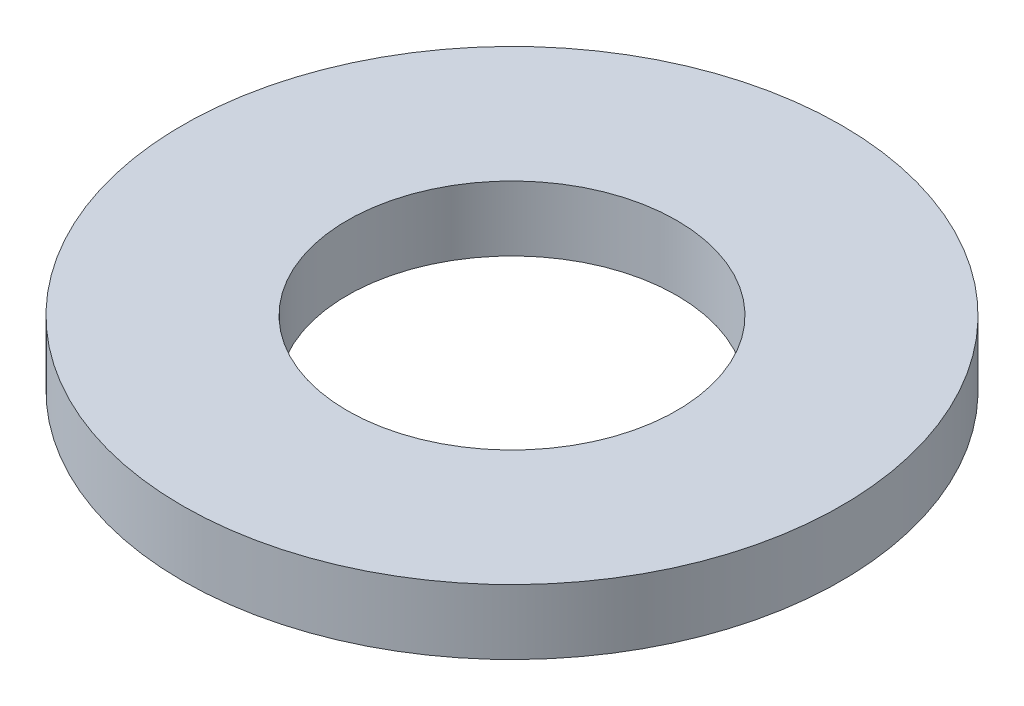
ISO-10303-21;
HEADER;
FILE_DESCRIPTION(('STEP AP214'),'2;1');
FILE_NAME('part.step','',(''),(''),'','','');
FILE_SCHEMA(('AUTOMOTIVE_DESIGN { 1 0 10303 214 1 1 1 1 }'));
ENDSEC;
DATA;
#1=APPLICATION_CONTEXT('core data for automotive mechanical design processes');
#2=APPLICATION_PROTOCOL_DEFINITION('international standard','automotive_design',2000,#1);
#3=PRODUCT_CONTEXT('',#1,'mechanical');
#4=PRODUCT('Part','Part','',(#3));
#5=PRODUCT_RELATED_PRODUCT_CATEGORY('part','',(#4));
#6=PRODUCT_DEFINITION_FORMATION('','',#4);
#7=PRODUCT_DEFINITION_CONTEXT('part definition',#1,'design');
#8=PRODUCT_DEFINITION('design','',#6,#7);
#9=PRODUCT_DEFINITION_SHAPE('','',#8);
#10=(LENGTH_UNIT() NAMED_UNIT(*) SI_UNIT(.MILLI.,.METRE.));
#11=(NAMED_UNIT(*) PLANE_ANGLE_UNIT() SI_UNIT($,.RADIAN.));
#12=(NAMED_UNIT(*) SI_UNIT($,.STERADIAN.) SOLID_ANGLE_UNIT());
#13=UNCERTAINTY_MEASURE_WITH_UNIT(LENGTH_MEASURE(1.E-05),#10,'distance_accuracy_value','');
#14=(GEOMETRIC_REPRESENTATION_CONTEXT(3) GLOBAL_UNCERTAINTY_ASSIGNED_CONTEXT((#13)) GLOBAL_UNIT_ASSIGNED_CONTEXT((#10,
#11,#12)) REPRESENTATION_CONTEXT('',''));
#15=CARTESIAN_POINT('',(0.,0.,0.));
#16=DIRECTION('',(0.,0.,1.));
#17=DIRECTION('',(1.,0.,0.));
#18=AXIS2_PLACEMENT_3D('',#15,#16,#17);
#19=CARTESIAN_POINT('',(0.,2.032,0.));
#20=DIRECTION('',(0.,-1.,0.));
#21=DIRECTION('',(0.,0.,-1.));
#22=AXIS2_PLACEMENT_3D('',#19,#20,#21);
#23=CYLINDRICAL_SURFACE('',#22,10.3124);
#24=CARTESIAN_POINT('',(0.,2.032,0.));
#25=DIRECTION('',(0.,1.,0.));
#26=DIRECTION('',(0.,0.,1.));
#27=AXIS2_PLACEMENT_3D('',#24,#25,#26);
#28=CIRCLE('',#27,10.3124);
#29=CARTESIAN_POINT('',(0.,2.032,10.3124));
#30=VERTEX_POINT('',#29);
#31=EDGE_CURVE('E10',#30,#30,#28,.T.);
#32=ORIENTED_EDGE('',*,*,#31,.F.);
#33=EDGE_LOOP('',(#32));
#34=FACE_BOUND('',#33,.T.);
#35=CARTESIAN_POINT('',(0.,0.,0.));
#36=DIRECTION('',(0.,1.,0.));
#37=DIRECTION('',(0.,0.,1.));
#38=AXIS2_PLACEMENT_3D('',#35,#36,#37);
#39=CIRCLE('',#38,10.3124);
#40=CARTESIAN_POINT('',(0.,0.,10.3124));
#41=VERTEX_POINT('',#40);
#42=EDGE_CURVE('E35',#41,#41,#39,.T.);
#43=ORIENTED_EDGE('',*,*,#42,.T.);
#44=EDGE_LOOP('',(#43));
#45=FACE_BOUND('',#44,.T.);
#46=ADVANCED_FACE('F32',(#34,#45),#23,.T.);
#47=CARTESIAN_POINT('',(0.,2.032,0.));
#48=DIRECTION('',(0.,1.,0.));
#49=DIRECTION('',(0.,0.,1.));
#50=AXIS2_PLACEMENT_3D('',#47,#48,#49);
#51=PLANE('',#50);
#52=CARTESIAN_POINT('',(0.,2.032,0.));
#53=DIRECTION('',(0.,1.,0.));
#54=DIRECTION('',(0.,0.,1.));
#55=AXIS2_PLACEMENT_3D('',#52,#53,#54);
#56=CIRCLE('',#55,5.1562);
#57=CARTESIAN_POINT('',(0.,2.032,5.1562));
#58=VERTEX_POINT('',#57);
#59=EDGE_CURVE('E47',#58,#58,#56,.T.);
#60=ORIENTED_EDGE('',*,*,#59,.F.);
#61=EDGE_LOOP('',(#60));
#62=FACE_BOUND('',#61,.T.);
#63=ORIENTED_EDGE('',*,*,#31,.T.);
#64=EDGE_LOOP('',(#63));
#65=FACE_BOUND('',#64,.T.);
#66=ADVANCED_FACE('F67',(#62,#65),#51,.T.);
#67=CARTESIAN_POINT('',(0.,0.,0.));
#68=DIRECTION('',(0.,1.,0.));
#69=DIRECTION('',(0.,0.,1.));
#70=AXIS2_PLACEMENT_3D('',#67,#68,#69);
#71=PLANE('',#70);
#72=CARTESIAN_POINT('',(0.,0.,0.));
#73=DIRECTION('',(0.,1.,0.));
#74=DIRECTION('',(0.,0.,1.));
#75=AXIS2_PLACEMENT_3D('',#72,#73,#74);
#76=CIRCLE('',#75,5.1562);
#77=CARTESIAN_POINT('',(0.,0.,5.1562));
#78=VERTEX_POINT('',#77);
#79=EDGE_CURVE('E45',#78,#78,#76,.T.);
#80=ORIENTED_EDGE('',*,*,#79,.T.);
#81=EDGE_LOOP('',(#80));
#82=FACE_BOUND('',#81,.T.);
#83=ORIENTED_EDGE('',*,*,#42,.F.);
#84=EDGE_LOOP('',(#83));
#85=FACE_BOUND('',#84,.T.);
#86=ADVANCED_FACE('F58',(#82,#85),#71,.F.);
#87=CARTESIAN_POINT('',(0.,0.,0.));
#88=DIRECTION('',(0.,1.,0.));
#89=DIRECTION('',(0.,0.,1.));
#90=AXIS2_PLACEMENT_3D('',#87,#88,#89);
#91=CYLINDRICAL_SURFACE('',#90,5.1562);
#92=ORIENTED_EDGE('',*,*,#79,.F.);
#93=EDGE_LOOP('',(#92));
#94=FACE_BOUND('',#93,.T.);
#95=ORIENTED_EDGE('',*,*,#59,.T.);
#96=EDGE_LOOP('',(#95));
#97=FACE_BOUND('',#96,.T.);
#98=ADVANCED_FACE('F61',(#94,#97),#91,.F.);
#99=CLOSED_SHELL('',(#46,#66,#86,#98));
#100=MANIFOLD_SOLID_BREP('B2',#99);
#101=ADVANCED_BREP_SHAPE_REPRESENTATION('',(#18,#100),#14);
#102=SHAPE_DEFINITION_REPRESENTATION(#9,#101);
ENDSEC;
END-ISO-10303-21;
